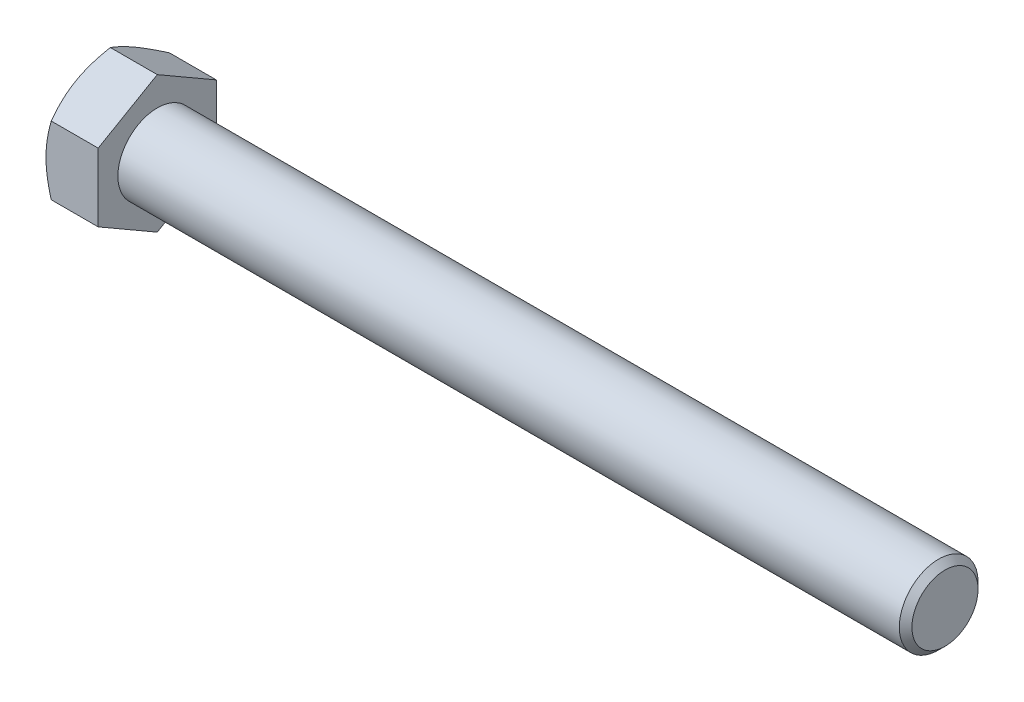
ISO-10303-21;
HEADER;
FILE_DESCRIPTION(('STEP AP214'),'2;1');
FILE_NAME('part.step','',(''),(''),'','','');
FILE_SCHEMA(('AUTOMOTIVE_DESIGN { 1 0 10303 214 1 1 1 1 }'));
ENDSEC;
DATA;
#1=APPLICATION_CONTEXT('core data for automotive mechanical design processes');
#2=APPLICATION_PROTOCOL_DEFINITION('international standard','automotive_design',2000,#1);
#3=PRODUCT_CONTEXT('',#1,'mechanical');
#4=PRODUCT('Part','Part','',(#3));
#5=PRODUCT_RELATED_PRODUCT_CATEGORY('part','',(#4));
#6=PRODUCT_DEFINITION_FORMATION('','',#4);
#7=PRODUCT_DEFINITION_CONTEXT('part definition',#1,'design');
#8=PRODUCT_DEFINITION('design','',#6,#7);
#9=PRODUCT_DEFINITION_SHAPE('','',#8);
#10=(LENGTH_UNIT() NAMED_UNIT(*) SI_UNIT(.MILLI.,.METRE.));
#11=(NAMED_UNIT(*) PLANE_ANGLE_UNIT() SI_UNIT($,.RADIAN.));
#12=(NAMED_UNIT(*) SI_UNIT($,.STERADIAN.) SOLID_ANGLE_UNIT());
#13=UNCERTAINTY_MEASURE_WITH_UNIT(LENGTH_MEASURE(1.E-05),#10,'distance_accuracy_value','');
#14=(GEOMETRIC_REPRESENTATION_CONTEXT(3) GLOBAL_UNCERTAINTY_ASSIGNED_CONTEXT((#13)) GLOBAL_UNIT_ASSIGNED_CONTEXT((#10,
#11,#12)) REPRESENTATION_CONTEXT('',''));
#15=CARTESIAN_POINT('',(0.,0.,0.));
#16=DIRECTION('',(0.,0.,1.));
#17=DIRECTION('',(1.,0.,0.));
#18=AXIS2_PLACEMENT_3D('',#15,#16,#17);
#19=CARTESIAN_POINT('',(7.95,5.19615242270662,-9.));
#20=DIRECTION('',(0.,-0.866025403784438,0.500000000000001));
#21=DIRECTION('',(0.,-0.500000000000001,-0.866025403784438));
#22=AXIS2_PLACEMENT_3D('',#19,#20,#21);
#23=PLANE('',#22);
#24=CARTESIAN_POINT('',(0.803914245071134,10.3924203154671,0.0002));
#25=CARTESIAN_POINT('',(0.737982001874057,10.2782163639798,-0.197607046401217));
#26=CARTESIAN_POINT('',(0.675041409210314,10.1635669787649,-0.396185606649945));
#27=CARTESIAN_POINT('',(0.555968997655538,9.93333715083391,-0.794955366044209));
#28=CARTESIAN_POINT('',(0.499840117752063,9.81775632901308,-0.99514722181845));
#29=CARTESIAN_POINT('',(0.395151960728963,9.58544915100228,-1.3975150570961));
#30=CARTESIAN_POINT('',(0.346610772912787,9.46872074181186,-1.5996945925006));
#31=CARTESIAN_POINT('',(0.258148516787921,9.23447001335913,-2.00542875589075));
#32=CARTESIAN_POINT('',(0.218225687483274,9.11694786135374,-2.20898309417891));
#33=CARTESIAN_POINT('',(0.148684674147114,8.88408932604662,-2.61230590830691));
#34=CARTESIAN_POINT('',(0.1188375028478,8.76877014301847,-2.812044592399));
#35=CARTESIAN_POINT('',(0.0687933098590819,8.53761579013205,-3.21241567598899));
#36=CARTESIAN_POINT('',(0.0485954355375394,8.42178066677662,-3.4130479949416));
#37=CARTESIAN_POINT('',(0.0183543473973461,8.18990950036671,-3.81466063597382));
#38=CARTESIAN_POINT('',(0.00829960958430231,8.07387383570153,-4.01564030266394));
#39=CARTESIAN_POINT('',(-0.00143766485491896,7.84169571742973,-4.41778459991642));
#40=CARTESIAN_POINT('',(-0.00112052193524554,7.72555326723328,-4.61894922457222));
#41=CARTESIAN_POINT('',(0.00916395215317117,7.50842142195782,-4.9950326125305));
#42=CARTESIAN_POINT('',(0.0178767400303951,7.40741671639994,-5.16997789436029));
#43=CARTESIAN_POINT('',(0.0429773400653679,7.20564389241818,-5.51945867708335));
#44=CARTESIAN_POINT('',(0.0593656695806674,7.10487579040239,-5.69399414955697));
#45=CARTESIAN_POINT('',(0.119656556235828,6.8029615939808,-6.2169248772855));
#46=CARTESIAN_POINT('',(0.174677482341126,6.60234990505054,-6.56439451510491));
#47=CARTESIAN_POINT('',(0.312230476325148,6.1989985076226,-7.263019628754));
#48=CARTESIAN_POINT('',(0.395345618627104,5.99631027619252,-7.61408594368717));
#49=CARTESIAN_POINT('',(0.583982539436458,5.59395639760763,-8.3109833040186));
#50=CARTESIAN_POINT('',(0.689460012893353,5.39428559809852,-8.65682327355628));
#51=CARTESIAN_POINT('',(0.803914245071127,5.19603695265279,-9.0002));
#52=B_SPLINE_CURVE_WITH_KNOTS('',3,(#24,#25,#26,#27,#28,#29,#30,#31,#32,#33,#34,#35,#36,#37,#38,
#39,#40,#41,#42,#43,#44,#45,#46,#47,#48,#49,#50,#51),.UNSPECIFIED.,.F.,.F.,(4,2,2,2,2,2,2,2,2,2,
2,2,2,4),(0.,0.713219249102578,1.42674513853509,2.14194697262263,2.85700253034481,
3.55449749123034,4.25193080859215,4.94857085059645,5.64518936892663,6.25162976378284,
6.85811104066341,8.07193747617895,9.31268391793542,10.5509947443908),.UNSPECIFIED.);
#53=CARTESIAN_POINT('',(0.803847577293368,10.3923048454133,0.));
#54=VERTEX_POINT('',#53);
#55=CARTESIAN_POINT('',(0.,7.79422863405994,-4.50000000000001));
#56=VERTEX_POINT('',#55);
#57=EDGE_CURVE('E53',#54,#56,#52,.T.);
#58=ORIENTED_EDGE('',*,*,#57,.F.);
#59=DIRECTION('',(-1.,0.,0.));
#60=VECTOR('',#59,1.);
#61=CARTESIAN_POINT('',(7.95,10.3923048454133,0.));
#62=LINE('',#61,#60);
#63=CARTESIAN_POINT('',(7.95,10.3923048454133,0.));
#64=VERTEX_POINT('',#63);
#65=EDGE_CURVE('E149',#64,#54,#62,.T.);
#66=ORIENTED_EDGE('',*,*,#65,.F.);
#67=DIRECTION('',(0.,0.500000000000001,0.866025403784438));
#68=VECTOR('',#67,1.);
#69=CARTESIAN_POINT('',(7.95,5.19615242270662,-9.));
#70=LINE('',#69,#68);
#71=CARTESIAN_POINT('',(7.95,5.19615242270662,-9.));
#72=VERTEX_POINT('',#71);
#73=EDGE_CURVE('E234',#72,#64,#70,.T.);
#74=ORIENTED_EDGE('',*,*,#73,.F.);
#75=DIRECTION('',(-1.,0.,0.));
#76=VECTOR('',#75,1.);
#77=CARTESIAN_POINT('',(7.95,5.19615242270662,-9.));
#78=LINE('',#77,#76);
#79=CARTESIAN_POINT('',(0.803847577293361,5.19615242270662,-9.));
#80=VERTEX_POINT('',#79);
#81=EDGE_CURVE('E137',#72,#80,#78,.T.);
#82=ORIENTED_EDGE('',*,*,#81,.T.);
#83=EDGE_CURVE('E131',#56,#80,#52,.T.);
#84=ORIENTED_EDGE('',*,*,#83,.F.);
#85=EDGE_LOOP('',(#58,#66,#74,#82,#84));
#86=FACE_BOUND('',#85,.T.);
#87=ADVANCED_FACE('F37',(#86),#23,.F.);
#88=CARTESIAN_POINT('',(7.95,10.3923048454133,0.));
#89=DIRECTION('',(0.,-0.866025403784438,-0.500000000000001));
#90=DIRECTION('',(0.,0.500000000000001,-0.866025403784438));
#91=AXIS2_PLACEMENT_3D('',#88,#89,#90);
#92=PLANE('',#91);
#93=CARTESIAN_POINT('',(0.803914245071126,5.19603695265279,9.0002));
#94=CARTESIAN_POINT('',(0.737982001874048,5.31024090414014,8.80239295359878));
#95=CARTESIAN_POINT('',(0.675041409210306,5.42489028935503,8.60381439335005));
#96=CARTESIAN_POINT('',(0.555968997655531,5.65512011728599,8.20504463395579));
#97=CARTESIAN_POINT('',(0.499840117752058,5.77070093910682,8.00485277818155));
#98=CARTESIAN_POINT('',(0.395151960728958,6.00300811711761,7.6024849429039));
#99=CARTESIAN_POINT('',(0.346610772912782,6.11973652630803,7.40030540749941));
#100=CARTESIAN_POINT('',(0.258148516787917,6.35398725476077,6.99457124410926));
#101=CARTESIAN_POINT('',(0.218225687483271,6.47150940676615,6.79101690582109));
#102=CARTESIAN_POINT('',(0.148684674147112,6.70436794207328,6.38769409169309));
#103=CARTESIAN_POINT('',(0.118837502847798,6.81968712510142,6.187955407601));
#104=CARTESIAN_POINT('',(0.0687933098590804,7.05084147798785,5.78758432401101));
#105=CARTESIAN_POINT('',(0.0485954355375385,7.16667660134328,5.5869520050584));
#106=CARTESIAN_POINT('',(0.0183543473973465,7.39854776775318,5.18533936402619));
#107=CARTESIAN_POINT('',(0.00829960958430332,7.51458343241836,4.98435969733607));
#108=CARTESIAN_POINT('',(-0.00143766485491797,7.74676155069016,4.58221540008358));
#109=CARTESIAN_POINT('',(-0.00112052193524518,7.86290400088662,4.38105077542778));
#110=CARTESIAN_POINT('',(0.0091639521531718,8.08003584616208,4.0049673874695));
#111=CARTESIAN_POINT('',(0.0178767400303964,8.18104055171996,3.83002210563971));
#112=CARTESIAN_POINT('',(0.0429773400653706,8.38281337570172,3.48054132291666));
#113=CARTESIAN_POINT('',(0.0593656695806706,8.4835814777175,3.30600585044303));
#114=CARTESIAN_POINT('',(0.119656556235832,8.7854956741391,2.7830751227145));
#115=CARTESIAN_POINT('',(0.17467748234113,8.98610736306936,2.43560548489509));
#116=CARTESIAN_POINT('',(0.312230476325153,9.38945876049729,1.736980371246));
#117=CARTESIAN_POINT('',(0.39534561862711,9.59214699192737,1.38591405631283));
#118=CARTESIAN_POINT('',(0.583982539436465,9.99450087051227,0.689016695981395));
#119=CARTESIAN_POINT('',(0.68946001289336,10.1941716700214,0.343176726443721));
#120=CARTESIAN_POINT('',(0.803914245071134,10.3924203154671,-0.000200000000000168));
#121=B_SPLINE_CURVE_WITH_KNOTS('',3,(#93,#94,#95,#96,#97,#98,#99,#100,#101,#102,#103,#104,#105,
#106,#107,#108,#109,#110,#111,#112,#113,#114,#115,#116,#117,#118,#119,#120),.UNSPECIFIED.,.F.,
.F.,(4,2,2,2,2,2,2,2,2,2,2,2,2,4),(0.,0.713219249102577,1.42674513853509,2.14194697262263,
2.8570025303448,3.55449749123034,4.25193080859215,4.94857085059645,5.64518936892662,
6.25162976378283,6.8581110406634,8.07193747617894,9.31268391793542,10.5509947443908),.UNSPECIFIED.);
#122=CARTESIAN_POINT('',(0.803847577293361,5.19615242270663,9.));
#123=VERTEX_POINT('',#122);
#124=CARTESIAN_POINT('',(0.,7.79422863405994,4.50000000000001));
#125=VERTEX_POINT('',#124);
#126=EDGE_CURVE('E60',#123,#125,#121,.T.);
#127=ORIENTED_EDGE('',*,*,#126,.F.);
#128=DIRECTION('',(-1.,0.,0.));
#129=VECTOR('',#128,1.);
#130=CARTESIAN_POINT('',(7.95,5.19615242270663,9.));
#131=LINE('',#130,#129);
#132=CARTESIAN_POINT('',(7.95,5.19615242270663,9.));
#133=VERTEX_POINT('',#132);
#134=EDGE_CURVE('E147',#133,#123,#131,.T.);
#135=ORIENTED_EDGE('',*,*,#134,.F.);
#136=DIRECTION('',(0.,-0.500000000000001,0.866025403784438));
#137=VECTOR('',#136,1.);
#138=CARTESIAN_POINT('',(7.95,10.3923048454133,0.));
#139=LINE('',#138,#137);
#140=EDGE_CURVE('E232',#64,#133,#139,.T.);
#141=ORIENTED_EDGE('',*,*,#140,.F.);
#142=ORIENTED_EDGE('',*,*,#65,.T.);
#143=EDGE_CURVE('E164',#125,#54,#121,.T.);
#144=ORIENTED_EDGE('',*,*,#143,.F.);
#145=EDGE_LOOP('',(#127,#135,#141,#142,#144));
#146=FACE_BOUND('',#145,.T.);
#147=ADVANCED_FACE('F170',(#146),#92,.F.);
#148=CARTESIAN_POINT('',(7.95,5.19615242270663,9.));
#149=DIRECTION('',(0.,0.,-1.));
#150=DIRECTION('',(-1.,0.,0.));
#151=AXIS2_PLACEMENT_3D('',#148,#149,#150);
#152=PLANE('',#151);
#153=CARTESIAN_POINT('',(4.50308345116275,-14.1853984650015,9.));
#154=CARTESIAN_POINT('',(4.31054430443782,-13.7903499522351,9.));
#155=CARTESIAN_POINT('',(4.11978647586972,-13.3944187196266,9.));
#156=CARTESIAN_POINT('',(3.74283090620236,-12.6003222266754,9.));
#157=CARTESIAN_POINT('',(3.55663384146592,-12.2021566456113,9.));
#158=CARTESIAN_POINT('',(3.18890856344588,-11.4011783965729,9.));
#159=CARTESIAN_POINT('',(3.00740939067649,-10.9983523517115,9.));
#160=CARTESIAN_POINT('',(2.65153988681447,-10.1895752665153,9.));
#161=CARTESIAN_POINT('',(2.47716923358452,-9.78362436837962,9.));
#162=CARTESIAN_POINT('',(2.1316124492693,-8.953981891894,9.));
#163=CARTESIAN_POINT('',(1.96074001408348,-8.53015895315933,9.));
#164=CARTESIAN_POINT('',(1.63138410023259,-7.67764040403061,9.));
#165=CARTESIAN_POINT('',(1.47290197976961,-7.24894426532904,9.));
#166=CARTESIAN_POINT('',(1.17232155137939,-6.38672363138015,9.));
#167=CARTESIAN_POINT('',(1.0301919447447,-5.95321016213059,9.));
#168=CARTESIAN_POINT('',(0.766724668389701,-5.07998336095625,9.));
#169=CARTESIAN_POINT('',(0.645380685452063,-4.64027195560254,9.));
#170=CARTESIAN_POINT('',(0.429822600041206,-3.75682505769697,9.));
#171=CARTESIAN_POINT('',(0.335452586446509,-3.31312863828557,9.));
#172=CARTESIAN_POINT('',(0.218090109997791,-2.6433671330566,9.));
#173=CARTESIAN_POINT('',(0.1829998621584,-2.41939560703653,9.));
#174=CARTESIAN_POINT('',(0.121565667357827,-1.9702635438669,9.));
#175=CARTESIAN_POINT('',(0.0952208701204421,-1.74510312447118,9.));
#176=CARTESIAN_POINT('',(0.0521451472278591,-1.29693480879161,9.));
#177=CARTESIAN_POINT('',(0.035288979864266,-1.07393900194961,9.));
#178=CARTESIAN_POINT('',(0.0110310639342774,-0.627433600763141,9.));
#179=CARTESIAN_POINT('',(0.00362915208926337,-0.40392401535862,9.));
#180=CARTESIAN_POINT('',(-0.0015426237921756,0.0432079361744999,9.));
#181=CARTESIAN_POINT('',(0.000687480645623076,0.266830301931571,9.));
#182=CARTESIAN_POINT('',(0.0147226077234496,0.713776872824072,9.));
#183=CARTESIAN_POINT('',(0.0265280659473006,0.93710106393258,9.));
#184=CARTESIAN_POINT('',(0.0656502898571863,1.46707211896635,9.));
#185=CARTESIAN_POINT('',(0.0971347677291198,1.77341845056802,9.));
#186=CARTESIAN_POINT('',(0.176454333238004,2.38397028008967,9.));
#187=CARTESIAN_POINT('',(0.224291457717822,2.6881755064995,9.));
#188=CARTESIAN_POINT('',(0.389806402965326,3.59715813116676,9.));
#189=CARTESIAN_POINT('',(0.529461896846416,4.19799412652232,9.));
#190=CARTESIAN_POINT('',(0.773331871848972,5.09670706348811,9.));
#191=CARTESIAN_POINT('',(0.861532431142633,5.39919910543196,9.));
#192=CARTESIAN_POINT('',(1.04752099203163,6.00125026101996,9.));
#193=CARTESIAN_POINT('',(1.14530906206943,6.30080935370986,9.));
#194=CARTESIAN_POINT('',(1.34886866039496,6.89708058771342,9.));
#195=CARTESIAN_POINT('',(1.45463787690012,7.19379352557788,9.));
#196=CARTESIAN_POINT('',(1.6728730196874,7.78473287386445,9.));
#197=CARTESIAN_POINT('',(1.78533883473293,8.07895932549671,9.));
#198=CARTESIAN_POINT('',(2.07523735271454,8.8161944490185,9.));
#199=CARTESIAN_POINT('',(2.25629467011385,9.25777584408897,9.));
#200=CARTESIAN_POINT('',(2.62827522263087,10.1367776511578,9.));
#201=CARTESIAN_POINT('',(2.81919928705199,10.5741977097237,9.));
#202=CARTESIAN_POINT('',(3.20877963371492,11.4457286497122,9.));
#203=CARTESIAN_POINT('',(3.40743823107647,11.8798384930871,9.));
#204=CARTESIAN_POINT('',(3.81079737205718,12.7452179469075,9.));
#205=CARTESIAN_POINT('',(4.01549773502308,13.1764876418049,9.));
#206=CARTESIAN_POINT('',(4.43000777500988,14.0372827141758,9.));
#207=CARTESIAN_POINT('',(4.63982402220295,14.466804921625,9.));
#208=CARTESIAN_POINT('',(5.06336871339291,15.3239162694583,9.));
#209=CARTESIAN_POINT('',(5.27709718099328,15.7515053981603,9.));
#210=CARTESIAN_POINT('',(5.70771289609102,16.6049951424422,9.));
#211=CARTESIAN_POINT('',(5.92459958876705,17.0308960382694,9.));
#212=CARTESIAN_POINT('',(6.36101693257489,17.8813418239716,9.));
#213=CARTESIAN_POINT('',(6.58054759472946,18.305886708184,9.));
#214=CARTESIAN_POINT('',(7.20096689356043,19.4981240117253,9.));
#215=CARTESIAN_POINT('',(7.60436223424866,20.2645118375987,9.));
#216=CARTESIAN_POINT('',(8.41646747703506,21.7945065925678,9.));
#217=CARTESIAN_POINT('',(8.82517763220602,22.558113387008,9.));
#218=CARTESIAN_POINT('',(9.6453899211846,24.08088542414,9.));
#219=CARTESIAN_POINT('',(10.0568800806834,24.8400571209878,9.));
#220=CARTESIAN_POINT('',(10.6764233675492,25.9775231898088,9.));
#221=CARTESIAN_POINT('',(10.8833155902988,26.3564507889065,9.));
#222=CARTESIAN_POINT('',(11.2977907102886,27.1139273756374,9.));
#223=CARTESIAN_POINT('',(11.5053736065156,27.492476363825,9.));
#224=CARTESIAN_POINT('',(11.7132605802833,27.8708583347745,9.));
#225=B_SPLINE_CURVE_WITH_KNOTS('',3,(#153,#154,#155,#156,#157,#158,#159,#160,#161,#162,#163,
#164,#165,#166,#167,#168,#169,#170,#171,#172,#173,#174,#175,#176,#177,#178,#179,#180,#181,#182,
#183,#184,#185,#186,#187,#188,#189,#190,#191,#192,#193,#194,#195,#196,#197,#198,#199,#200,#201,
#202,#203,#204,#205,#206,#207,#208,#209,#210,#211,#212,#213,#214,#215,#216,#217,#218,#219,#220,
#221,#222,#223,#224),.UNSPECIFIED.,.F.,.F.,(4,2,2,2,2,2,2,2,2,2,2,2,2,2,2,2,2,2,2,2,2,2,2,2,2,2,
2,2,2,2,2,2,2,2,2,4),(0.,1.31842765114837,2.6370496560634,3.96247407620814,5.28783853415267,
6.65860358746618,8.02951869129602,9.39776460603692,10.7655942037287,12.1253499441535,
12.8053173169584,13.4852185605779,14.1559216013657,14.8266130586982,15.4973023208461,
16.1680220944284,17.0913849082023,18.0148627755644,19.862742604473,20.8079230410616,
21.75311022551,22.6980246745778,23.6429234321322,25.0745302305723,26.5062575523684,
27.9384167676661,29.3705332036396,30.8045973553514,32.2386701620091,33.6724940065178,
35.1063238307243,37.7045032490066,40.3028068397952,42.8933552129342,44.1885437295509,
45.4837303472313),.UNSPECIFIED.);
#226=CARTESIAN_POINT('',(0.803847577293355,-5.1961524227066,9.));
#227=VERTEX_POINT('',#226);
#228=CARTESIAN_POINT('',(0.,0.,9.));
#229=VERTEX_POINT('',#228);
#230=EDGE_CURVE('E244',#227,#229,#225,.T.);
#231=ORIENTED_EDGE('',*,*,#230,.F.);
#232=DIRECTION('',(-1.,0.,0.));
#233=VECTOR('',#232,1.);
#234=CARTESIAN_POINT('',(7.95,-5.19615242270661,9.));
#235=LINE('',#234,#233);
#236=CARTESIAN_POINT('',(7.95,-5.19615242270661,9.));
#237=VERTEX_POINT('',#236);
#238=EDGE_CURVE('E139',#237,#227,#235,.T.);
#239=ORIENTED_EDGE('',*,*,#238,.F.);
#240=DIRECTION('',(0.,-1.,0.));
#241=VECTOR('',#240,1.);
#242=CARTESIAN_POINT('',(7.95,5.19615242270663,9.));
#243=LINE('',#242,#241);
#244=EDGE_CURVE('E228',#133,#237,#243,.T.);
#245=ORIENTED_EDGE('',*,*,#244,.F.);
#246=ORIENTED_EDGE('',*,*,#134,.T.);
#247=EDGE_CURVE('E186',#229,#123,#225,.T.);
#248=ORIENTED_EDGE('',*,*,#247,.F.);
#249=EDGE_LOOP('',(#231,#239,#245,#246,#248));
#250=FACE_BOUND('',#249,.T.);
#251=ADVANCED_FACE('F250',(#250),#152,.F.);
#252=CARTESIAN_POINT('',(7.95,-10.3923048454133,0.));
#253=DIRECTION('',(0.,0.866025403784438,-0.500000000000002));
#254=DIRECTION('',(0.,0.500000000000002,0.866025403784438));
#255=AXIS2_PLACEMENT_3D('',#252,#253,#254);
#256=PLANE('',#255);
#257=CARTESIAN_POINT('',(0.803914245071129,-10.3924203154671,-0.000200000000000038));
#258=CARTESIAN_POINT('',(0.73798200187405,-10.2782163639798,0.197607046401216));
#259=CARTESIAN_POINT('',(0.675041409210308,-10.1635669787649,0.396185606649944));
#260=CARTESIAN_POINT('',(0.555968997655532,-9.9333371508339,0.794955366044208));
#261=CARTESIAN_POINT('',(0.499840117752058,-9.81775632901307,0.995147221818449));
#262=CARTESIAN_POINT('',(0.395151960728958,-9.58544915100227,1.39751505709609));
#263=CARTESIAN_POINT('',(0.346610772912781,-9.46872074181185,1.59969459250059));
#264=CARTESIAN_POINT('',(0.258148516787915,-9.23447001335912,2.00542875589074));
#265=CARTESIAN_POINT('',(0.218225687483268,-9.11694786135373,2.20898309417891));
#266=CARTESIAN_POINT('',(0.148684674147108,-8.88408932604661,2.61230590830691));
#267=CARTESIAN_POINT('',(0.118837502847793,-8.76877014301846,2.812044592399));
#268=CARTESIAN_POINT('',(0.0687933098590749,-8.53761579013204,3.21241567598899));
#269=CARTESIAN_POINT('',(0.0485954355375332,-8.42178066677661,3.4130479949416));
#270=CARTESIAN_POINT('',(0.0183543473973407,-8.1899095003667,3.81466063597381));
#271=CARTESIAN_POINT('',(0.00829960958429683,-8.07387383570152,4.01564030266393));
#272=CARTESIAN_POINT('',(-0.00143766485492499,-7.84169571742972,4.41778459991642));
#273=CARTESIAN_POINT('',(-0.00112052193525201,-7.72555326723327,4.61894922457221));
#274=CARTESIAN_POINT('',(0.00916395215316418,-7.50842142195781,4.99503261253049));
#275=CARTESIAN_POINT('',(0.017876740030388,-7.40741671639992,5.16997789436028));
#276=CARTESIAN_POINT('',(0.0429773400653607,-7.20564389241817,5.51945867708334));
#277=CARTESIAN_POINT('',(0.0593656695806602,-7.10487579040238,5.69399414955696));
#278=CARTESIAN_POINT('',(0.11965655623582,-6.80296159398078,6.2169248772855));
#279=CARTESIAN_POINT('',(0.174677482341119,-6.60234990505052,6.56439451510491));
#280=CARTESIAN_POINT('',(0.312230476325141,-6.19899850762259,7.263019628754));
#281=CARTESIAN_POINT('',(0.395345618627098,-5.99631027619251,7.61408594368717));
#282=CARTESIAN_POINT('',(0.583982539436452,-5.59395639760761,8.3109833040186));
#283=CARTESIAN_POINT('',(0.689460012893347,-5.3942855980985,8.65682327355628));
#284=CARTESIAN_POINT('',(0.803914245071121,-5.19603695265277,9.0002));
#285=B_SPLINE_CURVE_WITH_KNOTS('',3,(#257,#258,#259,#260,#261,#262,#263,#264,#265,#266,#267,
#268,#269,#270,#271,#272,#273,#274,#275,#276,#277,#278,#279,#280,#281,#282,#283,#284),
.UNSPECIFIED.,.F.,.F.,(4,2,2,2,2,2,2,2,2,2,2,2,2,4),(0.,0.713219249102578,1.42674513853509,
2.14194697262263,2.8570025303448,3.55449749123034,4.25193080859215,4.94857085059645,
5.64518936892663,6.25162976378284,6.85811104066341,8.07193747617895,9.31268391793542,
10.5509947443908),.UNSPECIFIED.);
#286=CARTESIAN_POINT('',(0.803847577293363,-10.3923048454133,0.));
#287=VERTEX_POINT('',#286);
#288=CARTESIAN_POINT('',(0.,-7.79422863405994,4.50000000000002));
#289=VERTEX_POINT('',#288);
#290=EDGE_CURVE('E172',#287,#289,#285,.T.);
#291=ORIENTED_EDGE('',*,*,#290,.F.);
#292=DIRECTION('',(-1.,0.,0.));
#293=VECTOR('',#292,1.);
#294=CARTESIAN_POINT('',(7.95,-10.3923048454133,0.));
#295=LINE('',#294,#293);
#296=CARTESIAN_POINT('',(7.95,-10.3923048454133,0.));
#297=VERTEX_POINT('',#296);
#298=EDGE_CURVE('E136',#297,#287,#295,.T.);
#299=ORIENTED_EDGE('',*,*,#298,.F.);
#300=DIRECTION('',(0.,-0.500000000000002,-0.866025403784437));
#301=VECTOR('',#300,1.);
#302=CARTESIAN_POINT('',(7.95,-10.3923048454133,0.));
#303=LINE('',#302,#301);
#304=EDGE_CURVE('E226',#237,#297,#303,.T.);
#305=ORIENTED_EDGE('',*,*,#304,.F.);
#306=ORIENTED_EDGE('',*,*,#238,.T.);
#307=EDGE_CURVE('E174',#289,#227,#285,.T.);
#308=ORIENTED_EDGE('',*,*,#307,.F.);
#309=EDGE_LOOP('',(#291,#299,#305,#306,#308));
#310=FACE_BOUND('',#309,.T.);
#311=ADVANCED_FACE('F222',(#310),#256,.F.);
#312=CARTESIAN_POINT('',(7.95,-5.19615242270664,-9.));
#313=DIRECTION('',(0.,0.866025403784439,0.499999999999999));
#314=DIRECTION('',(0.,-0.5,0.866025403784439));
#315=AXIS2_PLACEMENT_3D('',#312,#313,#314);
#316=PLANE('',#315);
#317=CARTESIAN_POINT('',(0.803914245071132,-5.1960369526528,-9.0002));
#318=CARTESIAN_POINT('',(0.737982001874053,-5.31024090414015,-8.80239295359879));
#319=CARTESIAN_POINT('',(0.675041409210311,-5.42489028935504,-8.60381439335006));
#320=CARTESIAN_POINT('',(0.555968997655536,-5.655120117286,-8.20504463395579));
#321=CARTESIAN_POINT('',(0.499840117752062,-5.77070093910683,-8.00485277818155));
#322=CARTESIAN_POINT('',(0.395151960728962,-6.00300811711762,-7.6024849429039));
#323=CARTESIAN_POINT('',(0.346610772912786,-6.11973652630805,-7.4003054074994));
#324=CARTESIAN_POINT('',(0.25814851678792,-6.35398725476078,-6.99457124410925));
#325=CARTESIAN_POINT('',(0.218225687483273,-6.47150940676616,-6.79101690582109));
#326=CARTESIAN_POINT('',(0.148684674147114,-6.70436794207328,-6.38769409169308));
#327=CARTESIAN_POINT('',(0.118837502847799,-6.81968712510143,-6.187955407601));
#328=CARTESIAN_POINT('',(0.0687933098590816,-7.05084147798786,-5.787584324011));
#329=CARTESIAN_POINT('',(0.0485954355375396,-7.16667660134328,-5.58695200505839));
#330=CARTESIAN_POINT('',(0.0183543473973474,-7.39854776775319,-5.18533936402618));
#331=CARTESIAN_POINT('',(0.0082996095843041,-7.51458343241837,-4.98435969733606));
#332=CARTESIAN_POINT('',(-0.00143766485491673,-7.74676155069017,-4.58221540008357));
#333=CARTESIAN_POINT('',(-0.00112052193524341,-7.86290400088662,-4.38105077542778));
#334=CARTESIAN_POINT('',(0.00916395215317354,-8.08003584616208,-4.0049673874695));
#335=CARTESIAN_POINT('',(0.0178767400303977,-8.18104055171996,-3.83002210563971));
#336=CARTESIAN_POINT('',(0.0429773400653705,-8.38281337570172,-3.48054132291665));
#337=CARTESIAN_POINT('',(0.0593656695806698,-8.48358147771751,-3.30600585044303));
#338=CARTESIAN_POINT('',(0.11965655623583,-8.7854956741391,-2.7830751227145));
#339=CARTESIAN_POINT('',(0.174677482341129,-8.98610736306936,-2.43560548489508));
#340=CARTESIAN_POINT('',(0.312230476325152,-9.38945876049729,-1.736980371246));
#341=CARTESIAN_POINT('',(0.395345618627107,-9.59214699192737,-1.38591405631283));
#342=CARTESIAN_POINT('',(0.58398253943646,-9.99450087051226,-0.689016695981395));
#343=CARTESIAN_POINT('',(0.689460012893355,-10.1941716700214,-0.343176726443722));
#344=CARTESIAN_POINT('',(0.803914245071129,-10.3924203154671,0.000200000000000234));
#345=B_SPLINE_CURVE_WITH_KNOTS('',3,(#317,#318,#319,#320,#321,#322,#323,#324,#325,#326,#327,
#328,#329,#330,#331,#332,#333,#334,#335,#336,#337,#338,#339,#340,#341,#342,#343,#344),
.UNSPECIFIED.,.F.,.F.,(4,2,2,2,2,2,2,2,2,2,2,2,2,4),(0.,0.713219249102577,1.42674513853509,
2.14194697262263,2.85700253034481,3.55449749123034,4.25193080859215,4.94857085059645,
5.64518936892663,6.25162976378284,6.85811104066341,8.07193747617894,9.31268391793541,
10.5509947443908),.UNSPECIFIED.);
#346=CARTESIAN_POINT('',(0.803847577293111,-5.19615242270702,-9.));
#347=VERTEX_POINT('',#346);
#348=CARTESIAN_POINT('',(0.,-7.79422863405995,-4.5));
#349=VERTEX_POINT('',#348);
#350=EDGE_CURVE('E113',#347,#349,#345,.T.);
#351=ORIENTED_EDGE('',*,*,#350,.F.);
#352=DIRECTION('',(-1.,0.,0.));
#353=VECTOR('',#352,1.);
#354=CARTESIAN_POINT('',(7.95,-5.19615242270664,-9.));
#355=LINE('',#354,#353);
#356=CARTESIAN_POINT('',(7.95,-5.19615242270664,-9.));
#357=VERTEX_POINT('',#356);
#358=EDGE_CURVE('E127',#357,#347,#355,.T.);
#359=ORIENTED_EDGE('',*,*,#358,.F.);
#360=DIRECTION('',(0.,0.5,-0.866025403784439));
#361=VECTOR('',#360,1.);
#362=CARTESIAN_POINT('',(7.95,-5.19615242270664,-9.));
#363=LINE('',#362,#361);
#364=EDGE_CURVE('E224',#297,#357,#363,.T.);
#365=ORIENTED_EDGE('',*,*,#364,.F.);
#366=ORIENTED_EDGE('',*,*,#298,.T.);
#367=EDGE_CURVE('E130',#349,#287,#345,.T.);
#368=ORIENTED_EDGE('',*,*,#367,.F.);
#369=EDGE_LOOP('',(#351,#359,#365,#366,#368));
#370=FACE_BOUND('',#369,.T.);
#371=ADVANCED_FACE('F125',(#370),#316,.F.);
#372=CARTESIAN_POINT('',(7.95,5.19615242270662,-9.));
#373=DIRECTION('',(0.,0.,1.));
#374=DIRECTION('',(0.,-1.,0.));
#375=AXIS2_PLACEMENT_3D('',#372,#373,#374);
#376=PLANE('',#375);
#377=CARTESIAN_POINT('',(4.50308345606078,-14.1853984750485,-9.));
#378=CARTESIAN_POINT('',(4.31054430913195,-13.7903499619441,-9.));
#379=CARTESIAN_POINT('',(4.11978648036006,-13.3944187289972,-9.));
#380=CARTESIAN_POINT('',(3.74283091028612,-12.6003222353684,-9.));
#381=CARTESIAN_POINT('',(3.55663384534688,-12.2021566539649,-9.));
#382=CARTESIAN_POINT('',(3.18890856692114,-11.4011784042428,-9.));
#383=CARTESIAN_POINT('',(3.00740939394888,-10.998352359037,-9.));
#384=CARTESIAN_POINT('',(2.65153988968446,-10.1895752731496,-9.));
#385=CARTESIAN_POINT('',(2.47716923625496,-9.78362437466717,-9.));
#386=CARTESIAN_POINT('',(2.13161245153419,-8.95398189745991,-9.));
#387=CARTESIAN_POINT('',(1.96074001614284,-8.53015895835008,-9.));
#388=CARTESIAN_POINT('',(1.63138410189175,-7.6776404084651,-9.));
#389=CARTESIAN_POINT('',(1.4729019812341,-7.2489442693824,-9.));
#390=CARTESIAN_POINT('',(1.17232155247294,-6.38672363466423,-9.));
#391=CARTESIAN_POINT('',(1.03019194566191,-5.95321016502653,-9.));
#392=CARTESIAN_POINT('',(0.766724668982649,-5.07998336306546,-9.));
#393=CARTESIAN_POINT('',(0.645380685897062,-4.64027195731318,-9.));
#394=CARTESIAN_POINT('',(0.429822600187399,-3.75682505840834,-9.));
#395=CARTESIAN_POINT('',(0.335452586452977,-3.31312863839348,-9.));
#396=CARTESIAN_POINT('',(0.218090109862416,-2.64336713224848,-9.));
#397=CARTESIAN_POINT('',(0.182999861987047,-2.41939560592137,-9.));
#398=CARTESIAN_POINT('',(0.121565667139731,-1.97026354213498,-9.));
#399=CARTESIAN_POINT('',(0.0952208698915746,-1.74510312242953,-9.));
#400=CARTESIAN_POINT('',(0.0521451470049076,-1.29693480613701,-9.));
#401=CARTESIAN_POINT('',(0.0352889796574908,-1.07393899899182,-9.));
#402=CARTESIAN_POINT('',(0.0110310637867469,-0.627433597199462,-9.));
#403=CARTESIAN_POINT('',(0.00362915198480072,-0.403924011492235,-9.));
#404=CARTESIAN_POINT('',(-0.00154262378413872,0.0432079406441093,-9.));
#405=CARTESIAN_POINT('',(0.000687480723095751,0.266830306701699,-9.));
#406=CARTESIAN_POINT('',(0.0147226079643596,0.713776878191379,-9.));
#407=CARTESIAN_POINT('',(0.0265280662822145,0.937101069596547,-9.));
#408=CARTESIAN_POINT('',(0.065650290423212,1.46707212508443,-9.));
#409=CARTESIAN_POINT('',(0.0971347684278853,1.77341845684228,-9.));
#410=CARTESIAN_POINT('',(0.176454334209292,2.38397028666909,-9.));
#411=CARTESIAN_POINT('',(0.224291458828895,2.6881755132279,-9.));
#412=CARTESIAN_POINT('',(0.389806404498592,3.59715813833381,-9.));
#413=CARTESIAN_POINT('',(0.529461898664751,4.19799413397004,-9.));
#414=CARTESIAN_POINT('',(0.773331874087602,5.09670707135544,-9.));
#415=CARTESIAN_POINT('',(0.861532433522245,5.39919911344212,-9.));
#416=CARTESIAN_POINT('',(1.04752099468879,6.00125026931416,-9.));
#417=CARTESIAN_POINT('',(1.14530906486313,6.30080936214524,-9.));
#418=CARTESIAN_POINT('',(1.34886866345677,6.8970805964301,-9.));
#419=CARTESIAN_POINT('',(1.45463788009346,7.19379353443467,-9.));
#420=CARTESIAN_POINT('',(1.67287302313914,7.78473288300147,-9.));
#421=CARTESIAN_POINT('',(1.78533883831151,8.07895933477385,-9.));
#422=CARTESIAN_POINT('',(2.07523735650254,8.81619445838355,-9.));
#423=CARTESIAN_POINT('',(2.25629467397395,9.25777585340506,-9.));
#424=CARTESIAN_POINT('',(2.6282752266166,10.1367776603819,-9.));
#425=CARTESIAN_POINT('',(2.81919929109125,10.5741977189049,-9.));
#426=CARTESIAN_POINT('',(3.20877963784732,11.4457286588119,-9.));
#427=CARTESIAN_POINT('',(3.40743823524846,11.8798385021483,-9.));
#428=CARTESIAN_POINT('',(3.81079737629817,12.7452179558959,-9.));
#429=CARTESIAN_POINT('',(4.01549773929348,13.1764876507589,-9.));
#430=CARTESIAN_POINT('',(4.43000777933055,14.0372827230624,-9.));
#431=CARTESIAN_POINT('',(4.63982402654445,14.4668049304786,-9.));
#432=CARTESIAN_POINT('',(5.06336871777018,15.3239162782486,-9.));
#433=CARTESIAN_POINT('',(5.27709718538548,15.7515054069201,-9.));
#434=CARTESIAN_POINT('',(5.70771290050867,16.6049951511436,-9.));
#435=CARTESIAN_POINT('',(5.92459959319523,17.0308960469429,-9.));
#436=CARTESIAN_POINT('',(6.36101693702058,17.8813418325907,-9.));
#437=CARTESIAN_POINT('',(6.58054759918212,18.3058867167768,-9.));
#438=CARTESIAN_POINT('',(7.20096689804886,19.4981240202845,-9.));
#439=CARTESIAN_POINT('',(7.60436223876306,20.264511846152,-9.));
#440=CARTESIAN_POINT('',(8.41646748159571,21.794506601112,-9.));
#441=CARTESIAN_POINT('',(8.82517763678694,22.5581133955489,-9.));
#442=CARTESIAN_POINT('',(9.64538992580601,24.0808854326838,-9.));
#443=CARTESIAN_POINT('',(10.0568800853251,24.8400571295377,-9.));
#444=CARTESIAN_POINT('',(10.6764233722193,25.977523198369,-9.));
#445=CARTESIAN_POINT('',(10.883315594978,26.3564507974704,-9.));
#446=CARTESIAN_POINT('',(11.2977907149855,27.1139273842089,-9.));
#447=CARTESIAN_POINT('',(11.5053736112211,27.4924763724004,-9.));
#448=CARTESIAN_POINT('',(11.7132605849971,27.870858343354,-9.));
#449=B_SPLINE_CURVE_WITH_KNOTS('',3,(#377,#378,#379,#380,#381,#382,#383,#384,#385,#386,#387,
#388,#389,#390,#391,#392,#393,#394,#395,#396,#397,#398,#399,#400,#401,#402,#403,#404,#405,#406,
#407,#408,#409,#410,#411,#412,#413,#414,#415,#416,#417,#418,#419,#420,#421,#422,#423,#424,#425,
#426,#427,#428,#429,#430,#431,#432,#433,#434,#435,#436,#437,#438,#439,#440,#441,#442,#443,#444,
#445,#446,#447,#448),.UNSPECIFIED.,.F.,.F.,(4,2,2,2,2,2,2,2,2,2,2,2,2,2,2,2,2,2,2,2,2,2,2,2,2,2,
2,2,2,2,2,2,2,2,2,4),(0.,1.3184276523281,2.63704965842302,3.96247407975987,5.28783853889641,
6.65860359348417,8.02951869858868,9.39776461460017,10.7655942135616,12.1253499558398,
12.8053173295708,13.4852185741162,14.1559216158065,14.8266130740414,15.4973023370921,
16.1680221115773,17.0913849258576,18.0148627937263,19.8627426236502,20.8079230607688,
21.7531102457472,22.6980246953435,23.6429234534266,25.0745302518135,26.5062575735559,
27.9384167887983,29.3705332247166,30.804597376367,32.2386701829632,33.6724940274114,
35.1063238515574,37.7045032698604,40.3028068606692,42.8933552338532,44.1885437504927,
45.4837303681959),.UNSPECIFIED.);
#450=CARTESIAN_POINT('',(0.,0.,-9.));
#451=VERTEX_POINT('',#450);
#452=EDGE_CURVE('E119',#80,#451,#449,.F.);
#453=ORIENTED_EDGE('',*,*,#452,.F.);
#454=ORIENTED_EDGE('',*,*,#81,.F.);
#455=DIRECTION('',(0.,1.,0.));
#456=VECTOR('',#455,1.);
#457=CARTESIAN_POINT('',(7.95,5.19615242270662,-9.));
#458=LINE('',#457,#456);
#459=EDGE_CURVE('E135',#357,#72,#458,.T.);
#460=ORIENTED_EDGE('',*,*,#459,.F.);
#461=ORIENTED_EDGE('',*,*,#358,.T.);
#462=EDGE_CURVE('E110',#451,#347,#449,.F.);
#463=ORIENTED_EDGE('',*,*,#462,.F.);
#464=EDGE_LOOP('',(#453,#454,#460,#461,#463));
#465=FACE_BOUND('',#464,.T.);
#466=ADVANCED_FACE('F133',(#465),#376,.F.);
#467=CARTESIAN_POINT('',(7.95,10.3923048454133,0.));
#468=DIRECTION('',(1.,0.,0.));
#469=DIRECTION('',(0.,0.,-1.));
#470=AXIS2_PLACEMENT_3D('',#467,#468,#469);
#471=PLANE('',#470);
#472=CARTESIAN_POINT('',(7.95,0.,0.));
#473=DIRECTION('',(1.,0.,0.));
#474=DIRECTION('',(0.,0.,-1.));
#475=AXIS2_PLACEMENT_3D('',#472,#473,#474);
#476=CIRCLE('',#475,6.);
#477=CARTESIAN_POINT('',(7.95,0.,-6.));
#478=VERTEX_POINT('',#477);
#479=EDGE_CURVE('E237',#478,#478,#476,.F.);
#480=ORIENTED_EDGE('',*,*,#479,.T.);
#481=EDGE_LOOP('',(#480));
#482=FACE_BOUND('',#481,.T.);
#483=ORIENTED_EDGE('',*,*,#73,.T.);
#484=ORIENTED_EDGE('',*,*,#140,.T.);
#485=ORIENTED_EDGE('',*,*,#244,.T.);
#486=ORIENTED_EDGE('',*,*,#304,.T.);
#487=ORIENTED_EDGE('',*,*,#364,.T.);
#488=ORIENTED_EDGE('',*,*,#459,.T.);
#489=EDGE_LOOP('',(#483,#484,#485,#486,#487,#488));
#490=FACE_BOUND('',#489,.T.);
#491=ADVANCED_FACE('F252',(#482,#490),#471,.T.);
#492=CARTESIAN_POINT('',(0.,0.,0.));
#493=DIRECTION('',(-1.,0.,0.));
#494=DIRECTION('',(0.,0.,1.));
#495=AXIS2_PLACEMENT_3D('',#492,#493,#494);
#496=CYLINDRICAL_SURFACE('',#495,6.);
#497=ORIENTED_EDGE('',*,*,#479,.F.);
#498=EDGE_LOOP('',(#497));
#499=FACE_BOUND('',#498,.T.);
#500=CARTESIAN_POINT('',(126.986,0.,0.));
#501=DIRECTION('',(-1.,0.,0.));
#502=DIRECTION('',(0.,0.,1.));
#503=AXIS2_PLACEMENT_3D('',#500,#501,#502);
#504=CIRCLE('',#503,6.00000000000001);
#505=CARTESIAN_POINT('',(126.986,0.,6.00000000000001));
#506=VERTEX_POINT('',#505);
#507=EDGE_CURVE('E240',#506,#506,#504,.T.);
#508=ORIENTED_EDGE('',*,*,#507,.T.);
#509=EDGE_LOOP('',(#508));
#510=FACE_BOUND('',#509,.T.);
#511=ADVANCED_FACE('F283',(#499,#510),#496,.T.);
#512=CARTESIAN_POINT('',(127.95,0.,0.));
#513=DIRECTION('',(-1.,0.,0.));
#514=DIRECTION('',(0.,0.,1.));
#515=AXIS2_PLACEMENT_3D('',#512,#513,#514);
#516=CONICAL_SURFACE('',#515,5.036,0.785398163397585);
#517=ORIENTED_EDGE('',*,*,#507,.F.);
#518=EDGE_LOOP('',(#517));
#519=FACE_BOUND('',#518,.T.);
#520=CARTESIAN_POINT('',(127.95,0.,0.));
#521=DIRECTION('',(-1.,0.,0.));
#522=DIRECTION('',(0.,0.,1.));
#523=AXIS2_PLACEMENT_3D('',#520,#521,#522);
#524=CIRCLE('',#523,5.036);
#525=CARTESIAN_POINT('',(127.95,0.,5.036));
#526=VERTEX_POINT('',#525);
#527=EDGE_CURVE('E242',#526,#526,#524,.T.);
#528=ORIENTED_EDGE('',*,*,#527,.T.);
#529=EDGE_LOOP('',(#528));
#530=FACE_BOUND('',#529,.T.);
#531=ADVANCED_FACE('F286',(#519,#530),#516,.T.);
#532=CARTESIAN_POINT('',(127.95,0.,0.));
#533=DIRECTION('',(-1.,0.,0.));
#534=DIRECTION('',(0.,0.,1.));
#535=AXIS2_PLACEMENT_3D('',#532,#533,#534);
#536=PLANE('',#535);
#537=ORIENTED_EDGE('',*,*,#527,.F.);
#538=EDGE_LOOP('',(#537));
#539=FACE_BOUND('',#538,.T.);
#540=ADVANCED_FACE('F199',(#539),#536,.F.);
#541=CARTESIAN_POINT('',(0.,0.,0.));
#542=DIRECTION('',(1.,0.,0.));
#543=DIRECTION('',(0.,0.,-1.));
#544=AXIS2_PLACEMENT_3D('',#541,#542,#543);
#545=CONICAL_SURFACE('',#544,9.,1.0471975511966);
#546=ORIENTED_EDGE('',*,*,#350,.T.);
#547=CARTESIAN_POINT('',(0.,0.,0.));
#548=DIRECTION('',(1.,0.,0.));
#549=DIRECTION('',(0.,0.,-1.));
#550=AXIS2_PLACEMENT_3D('',#547,#548,#549);
#551=CIRCLE('',#550,9.);
#552=EDGE_CURVE('E41',#349,#451,#551,.T.);
#553=ORIENTED_EDGE('',*,*,#552,.T.);
#554=ORIENTED_EDGE('',*,*,#462,.T.);
#555=EDGE_LOOP('',(#546,#553,#554));
#556=FACE_BOUND('',#555,.T.);
#557=ADVANCED_FACE('F112',(#556),#545,.T.);
#558=ORIENTED_EDGE('',*,*,#290,.T.);
#559=EDGE_CURVE('E154',#289,#349,#551,.T.);
#560=ORIENTED_EDGE('',*,*,#559,.T.);
#561=ORIENTED_EDGE('',*,*,#367,.T.);
#562=EDGE_LOOP('',(#558,#560,#561));
#563=FACE_BOUND('',#562,.T.);
#564=ADVANCED_FACE('F198',(#563),#545,.T.);
#565=ORIENTED_EDGE('',*,*,#230,.T.);
#566=EDGE_CURVE('E155',#229,#289,#551,.T.);
#567=ORIENTED_EDGE('',*,*,#566,.T.);
#568=ORIENTED_EDGE('',*,*,#307,.T.);
#569=EDGE_LOOP('',(#565,#567,#568));
#570=FACE_BOUND('',#569,.T.);
#571=ADVANCED_FACE('F193',(#570),#545,.T.);
#572=ORIENTED_EDGE('',*,*,#247,.T.);
#573=ORIENTED_EDGE('',*,*,#126,.T.);
#574=CARTESIAN_POINT('',(0.,0.,0.));
#575=DIRECTION('',(-1.,0.,0.));
#576=DIRECTION('',(0.,0.,1.));
#577=AXIS2_PLACEMENT_3D('',#574,#575,#576);
#578=CIRCLE('',#577,9.);
#579=EDGE_CURVE('E120',#229,#125,#578,.T.);
#580=ORIENTED_EDGE('',*,*,#579,.F.);
#581=EDGE_LOOP('',(#572,#573,#580));
#582=FACE_BOUND('',#581,.T.);
#583=ADVANCED_FACE('F197',(#582),#545,.T.);
#584=ORIENTED_EDGE('',*,*,#143,.T.);
#585=ORIENTED_EDGE('',*,*,#57,.T.);
#586=EDGE_CURVE('E46',#56,#125,#551,.T.);
#587=ORIENTED_EDGE('',*,*,#586,.T.);
#588=EDGE_LOOP('',(#584,#585,#587));
#589=FACE_BOUND('',#588,.T.);
#590=ADVANCED_FACE('F163',(#589),#545,.T.);
#591=ORIENTED_EDGE('',*,*,#83,.T.);
#592=ORIENTED_EDGE('',*,*,#452,.T.);
#593=EDGE_CURVE('E11',#451,#56,#551,.T.);
#594=ORIENTED_EDGE('',*,*,#593,.T.);
#595=EDGE_LOOP('',(#591,#592,#594));
#596=FACE_BOUND('',#595,.T.);
#597=ADVANCED_FACE('F255',(#596),#545,.T.);
#598=CARTESIAN_POINT('',(0.,10.3923048454133,0.));
#599=DIRECTION('',(1.,0.,0.));
#600=DIRECTION('',(0.,0.,-1.));
#601=AXIS2_PLACEMENT_3D('',#598,#599,#600);
#602=PLANE('',#601);
#603=ORIENTED_EDGE('',*,*,#593,.F.);
#604=ORIENTED_EDGE('',*,*,#552,.F.);
#605=ORIENTED_EDGE('',*,*,#559,.F.);
#606=ORIENTED_EDGE('',*,*,#566,.F.);
#607=ORIENTED_EDGE('',*,*,#579,.T.);
#608=ORIENTED_EDGE('',*,*,#586,.F.);
#609=EDGE_LOOP('',(#603,#604,#605,#606,#607,#608));
#610=FACE_BOUND('',#609,.T.);
#611=ADVANCED_FACE('F167',(#610),#602,.F.);
#612=CLOSED_SHELL('',(#87,#147,#251,#311,#371,#466,#491,#511,#531,#540,#557,#564,#571,#583,#590,
#597,#611));
#613=MANIFOLD_SOLID_BREP('B2',#612);
#614=ADVANCED_BREP_SHAPE_REPRESENTATION('',(#18,#613),#14);
#615=SHAPE_DEFINITION_REPRESENTATION(#9,#614);
ENDSEC;
END-ISO-10303-21;
